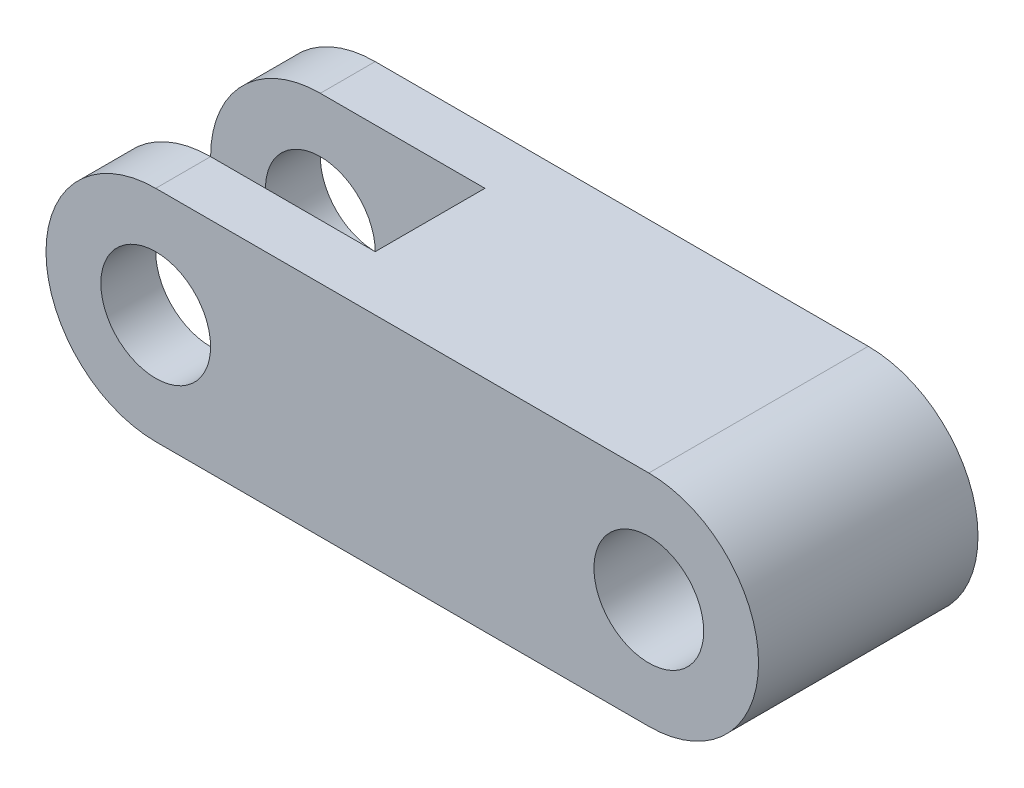
ISO-10303-21;
HEADER;
FILE_DESCRIPTION(('STEP AP214'),'2;1');
FILE_NAME('part.step','',(''),(''),'','','');
FILE_SCHEMA(('AUTOMOTIVE_DESIGN { 1 0 10303 214 1 1 1 1 }'));
ENDSEC;
DATA;
#1=APPLICATION_CONTEXT('core data for automotive mechanical design processes');
#2=APPLICATION_PROTOCOL_DEFINITION('international standard','automotive_design',2000,#1);
#3=PRODUCT_CONTEXT('',#1,'mechanical');
#4=PRODUCT('Part','Part','',(#3));
#5=PRODUCT_RELATED_PRODUCT_CATEGORY('part','',(#4));
#6=PRODUCT_DEFINITION_FORMATION('','',#4);
#7=PRODUCT_DEFINITION_CONTEXT('part definition',#1,'design');
#8=PRODUCT_DEFINITION('design','',#6,#7);
#9=PRODUCT_DEFINITION_SHAPE('','',#8);
#10=(LENGTH_UNIT() NAMED_UNIT(*) SI_UNIT(.MILLI.,.METRE.));
#11=(NAMED_UNIT(*) PLANE_ANGLE_UNIT() SI_UNIT($,.RADIAN.));
#12=(NAMED_UNIT(*) SI_UNIT($,.STERADIAN.) SOLID_ANGLE_UNIT());
#13=UNCERTAINTY_MEASURE_WITH_UNIT(LENGTH_MEASURE(1.E-05),#10,'distance_accuracy_value','');
#14=(GEOMETRIC_REPRESENTATION_CONTEXT(3) GLOBAL_UNCERTAINTY_ASSIGNED_CONTEXT((#13)) GLOBAL_UNIT_ASSIGNED_CONTEXT((#10,
#11,#12)) REPRESENTATION_CONTEXT('',''));
#15=CARTESIAN_POINT('',(0.,0.,0.));
#16=DIRECTION('',(0.,0.,1.));
#17=DIRECTION('',(1.,0.,0.));
#18=AXIS2_PLACEMENT_3D('',#15,#16,#17);
#19=CARTESIAN_POINT('',(0.,0.,-20.));
#20=DIRECTION('',(0.,0.,1.));
#21=DIRECTION('',(-1.,0.,0.));
#22=AXIS2_PLACEMENT_3D('',#19,#20,#21);
#23=CYLINDRICAL_SURFACE('',#22,10.);
#24=DIRECTION('',(0.,0.,1.));
#25=VECTOR('',#24,1.);
#26=CARTESIAN_POINT('',(0.,10.,-20.));
#27=LINE('',#26,#25);
#28=CARTESIAN_POINT('',(0.,10.,-20.));
#29=VERTEX_POINT('',#28);
#30=CARTESIAN_POINT('',(0.,10.,-15.));
#31=VERTEX_POINT('',#30);
#32=EDGE_CURVE('E177',#29,#31,#27,.T.);
#33=ORIENTED_EDGE('',*,*,#32,.F.);
#34=CARTESIAN_POINT('',(0.,0.,-20.));
#35=DIRECTION('',(0.,0.,1.));
#36=DIRECTION('',(1.,0.,0.));
#37=AXIS2_PLACEMENT_3D('',#34,#35,#36);
#38=CIRCLE('',#37,10.);
#39=CARTESIAN_POINT('',(0.,-10.,-20.));
#40=VERTEX_POINT('',#39);
#41=EDGE_CURVE('E159',#29,#40,#38,.T.);
#42=ORIENTED_EDGE('',*,*,#41,.T.);
#43=DIRECTION('',(0.,0.,1.));
#44=VECTOR('',#43,1.);
#45=CARTESIAN_POINT('',(0.,-10.,-20.));
#46=LINE('',#45,#44);
#47=CARTESIAN_POINT('',(0.,-10.,-15.));
#48=VERTEX_POINT('',#47);
#49=EDGE_CURVE('E11',#40,#48,#46,.T.);
#50=ORIENTED_EDGE('',*,*,#49,.T.);
#51=CARTESIAN_POINT('',(0.,0.,-15.));
#52=DIRECTION('',(0.,0.,1.));
#53=DIRECTION('',(1.,0.,0.));
#54=AXIS2_PLACEMENT_3D('',#51,#52,#53);
#55=CIRCLE('',#54,10.);
#56=EDGE_CURVE('E143',#31,#48,#55,.T.);
#57=ORIENTED_EDGE('',*,*,#56,.F.);
#58=EDGE_LOOP('',(#33,#42,#50,#57));
#59=FACE_BOUND('',#58,.T.);
#60=ADVANCED_FACE('F35',(#59),#23,.T.);
#61=CARTESIAN_POINT('',(0.,0.,-20.));
#62=DIRECTION('',(0.,0.,1.));
#63=DIRECTION('',(-1.,0.,0.));
#64=AXIS2_PLACEMENT_3D('',#61,#62,#63);
#65=CYLINDRICAL_SURFACE('',#64,5.);
#66=CARTESIAN_POINT('',(0.,0.,-15.));
#67=DIRECTION('',(0.,0.,1.));
#68=DIRECTION('',(1.,0.,0.));
#69=AXIS2_PLACEMENT_3D('',#66,#67,#68);
#70=CIRCLE('',#69,5.);
#71=CARTESIAN_POINT('',(5.,0.,-15.));
#72=VERTEX_POINT('',#71);
#73=EDGE_CURVE('E39',#72,#72,#70,.T.);
#74=ORIENTED_EDGE('',*,*,#73,.T.);
#75=EDGE_LOOP('',(#74));
#76=FACE_BOUND('',#75,.T.);
#77=CARTESIAN_POINT('',(0.,0.,-20.));
#78=DIRECTION('',(0.,0.,1.));
#79=DIRECTION('',(1.,0.,0.));
#80=AXIS2_PLACEMENT_3D('',#77,#78,#79);
#81=CIRCLE('',#80,5.);
#82=CARTESIAN_POINT('',(5.,0.,-20.));
#83=VERTEX_POINT('',#82);
#84=EDGE_CURVE('E153',#83,#83,#81,.T.);
#85=ORIENTED_EDGE('',*,*,#84,.F.);
#86=EDGE_LOOP('',(#85));
#87=FACE_BOUND('',#86,.T.);
#88=ADVANCED_FACE('F200',(#76,#87),#65,.F.);
#89=CARTESIAN_POINT('',(0.,0.,-20.));
#90=DIRECTION('',(0.,0.,-1.));
#91=DIRECTION('',(1.,0.,0.));
#92=AXIS2_PLACEMENT_3D('',#89,#90,#91);
#93=PLANE('',#92);
#94=ORIENTED_EDGE('',*,*,#84,.T.);
#95=EDGE_LOOP('',(#94));
#96=FACE_BOUND('',#95,.T.);
#97=ORIENTED_EDGE('',*,*,#41,.F.);
#98=DIRECTION('',(-1.,0.,0.));
#99=VECTOR('',#98,1.);
#100=CARTESIAN_POINT('',(0.,10.,-20.));
#101=LINE('',#100,#99);
#102=CARTESIAN_POINT('',(44.9357553758638,10.,-20.));
#103=VERTEX_POINT('',#102);
#104=EDGE_CURVE('E61',#103,#29,#101,.T.);
#105=ORIENTED_EDGE('',*,*,#104,.F.);
#106=CARTESIAN_POINT('',(44.9357553758638,0.,-20.));
#107=DIRECTION('',(0.,0.,1.));
#108=DIRECTION('',(1.,0.,0.));
#109=AXIS2_PLACEMENT_3D('',#106,#107,#108);
#110=CIRCLE('',#109,10.);
#111=CARTESIAN_POINT('',(44.9357553758638,-10.,-20.));
#112=VERTEX_POINT('',#111);
#113=EDGE_CURVE('E164',#112,#103,#110,.T.);
#114=ORIENTED_EDGE('',*,*,#113,.F.);
#115=DIRECTION('',(1.,0.,0.));
#116=VECTOR('',#115,1.);
#117=CARTESIAN_POINT('',(0.,-10.,-20.));
#118=LINE('',#117,#116);
#119=EDGE_CURVE('E89',#40,#112,#118,.T.);
#120=ORIENTED_EDGE('',*,*,#119,.F.);
#121=EDGE_LOOP('',(#97,#105,#114,#120));
#122=FACE_BOUND('',#121,.T.);
#123=CARTESIAN_POINT('',(44.9357553758638,0.,-20.));
#124=DIRECTION('',(0.,0.,1.));
#125=DIRECTION('',(1.,0.,0.));
#126=AXIS2_PLACEMENT_3D('',#123,#124,#125);
#127=CIRCLE('',#126,5.);
#128=CARTESIAN_POINT('',(49.9357553758638,0.,-20.));
#129=VERTEX_POINT('',#128);
#130=EDGE_CURVE('E147',#129,#129,#127,.T.);
#131=ORIENTED_EDGE('',*,*,#130,.T.);
#132=EDGE_LOOP('',(#131));
#133=FACE_BOUND('',#132,.T.);
#134=ADVANCED_FACE('F205',(#96,#122,#133),#93,.T.);
#135=CARTESIAN_POINT('',(0.,0.,0.));
#136=DIRECTION('',(0.,0.,-1.));
#137=DIRECTION('',(1.,0.,0.));
#138=AXIS2_PLACEMENT_3D('',#135,#136,#137);
#139=PLANE('',#138);
#140=CARTESIAN_POINT('',(0.,0.,0.));
#141=DIRECTION('',(0.,0.,1.));
#142=DIRECTION('',(1.,0.,0.));
#143=AXIS2_PLACEMENT_3D('',#140,#141,#142);
#144=CIRCLE('',#143,10.);
#145=CARTESIAN_POINT('',(0.,10.,0.));
#146=VERTEX_POINT('',#145);
#147=CARTESIAN_POINT('',(0.,-10.,0.));
#148=VERTEX_POINT('',#147);
#149=EDGE_CURVE('E156',#146,#148,#144,.T.);
#150=ORIENTED_EDGE('',*,*,#149,.T.);
#151=DIRECTION('',(1.,0.,0.));
#152=VECTOR('',#151,1.);
#153=CARTESIAN_POINT('',(0.,-10.,0.));
#154=LINE('',#153,#152);
#155=CARTESIAN_POINT('',(44.9357553758638,-10.,0.));
#156=VERTEX_POINT('',#155);
#157=EDGE_CURVE('E170',#148,#156,#154,.T.);
#158=ORIENTED_EDGE('',*,*,#157,.T.);
#159=CARTESIAN_POINT('',(44.9357553758638,0.,0.));
#160=DIRECTION('',(0.,0.,1.));
#161=DIRECTION('',(1.,0.,0.));
#162=AXIS2_PLACEMENT_3D('',#159,#160,#161);
#163=CIRCLE('',#162,10.);
#164=CARTESIAN_POINT('',(44.9357553758638,10.,0.));
#165=VERTEX_POINT('',#164);
#166=EDGE_CURVE('E173',#156,#165,#163,.T.);
#167=ORIENTED_EDGE('',*,*,#166,.T.);
#168=DIRECTION('',(-1.,0.,0.));
#169=VECTOR('',#168,1.);
#170=CARTESIAN_POINT('',(0.,10.,0.));
#171=LINE('',#170,#169);
#172=EDGE_CURVE('E162',#165,#146,#171,.T.);
#173=ORIENTED_EDGE('',*,*,#172,.T.);
#174=EDGE_LOOP('',(#150,#158,#167,#173));
#175=FACE_BOUND('',#174,.T.);
#176=CARTESIAN_POINT('',(0.,0.,0.));
#177=DIRECTION('',(0.,0.,1.));
#178=DIRECTION('',(1.,0.,0.));
#179=AXIS2_PLACEMENT_3D('',#176,#177,#178);
#180=CIRCLE('',#179,5.);
#181=CARTESIAN_POINT('',(5.,0.,0.));
#182=VERTEX_POINT('',#181);
#183=EDGE_CURVE('E150',#182,#182,#180,.T.);
#184=ORIENTED_EDGE('',*,*,#183,.F.);
#185=EDGE_LOOP('',(#184));
#186=FACE_BOUND('',#185,.T.);
#187=CARTESIAN_POINT('',(44.9357553758638,0.,0.));
#188=DIRECTION('',(0.,0.,1.));
#189=DIRECTION('',(1.,0.,0.));
#190=AXIS2_PLACEMENT_3D('',#187,#188,#189);
#191=CIRCLE('',#190,5.);
#192=CARTESIAN_POINT('',(49.9357553758638,0.,0.));
#193=VERTEX_POINT('',#192);
#194=EDGE_CURVE('E146',#193,#193,#191,.T.);
#195=ORIENTED_EDGE('',*,*,#194,.F.);
#196=EDGE_LOOP('',(#195));
#197=FACE_BOUND('',#196,.T.);
#198=ADVANCED_FACE('F210',(#175,#186,#197),#139,.F.);
#199=CARTESIAN_POINT('',(0.,0.,-5.));
#200=DIRECTION('',(0.,0.,-1.));
#201=DIRECTION('',(-1.,0.,0.));
#202=AXIS2_PLACEMENT_3D('',#199,#200,#201);
#203=CIRCLE('',#202,10.);
#204=CARTESIAN_POINT('',(0.,-10.,-5.));
#205=VERTEX_POINT('',#204);
#206=CARTESIAN_POINT('',(0.,10.,-5.));
#207=VERTEX_POINT('',#206);
#208=EDGE_CURVE('E141',#205,#207,#203,.T.);
#209=ORIENTED_EDGE('',*,*,#208,.F.);
#210=EDGE_CURVE('E44',#205,#148,#46,.T.);
#211=ORIENTED_EDGE('',*,*,#210,.T.);
#212=ORIENTED_EDGE('',*,*,#149,.F.);
#213=EDGE_CURVE('E82',#207,#146,#27,.T.);
#214=ORIENTED_EDGE('',*,*,#213,.F.);
#215=EDGE_LOOP('',(#209,#211,#212,#214));
#216=FACE_BOUND('',#215,.T.);
#217=ADVANCED_FACE('F37',(#216),#23,.T.);
#218=CARTESIAN_POINT('',(0.,-10.,-20.));
#219=DIRECTION('',(0.,1.,0.));
#220=DIRECTION('',(0.,0.,-1.));
#221=AXIS2_PLACEMENT_3D('',#218,#219,#220);
#222=PLANE('',#221);
#223=ORIENTED_EDGE('',*,*,#49,.F.);
#224=ORIENTED_EDGE('',*,*,#119,.T.);
#225=DIRECTION('',(0.,0.,1.));
#226=VECTOR('',#225,1.);
#227=CARTESIAN_POINT('',(44.9357553758638,-10.,-20.));
#228=LINE('',#227,#226);
#229=EDGE_CURVE('E181',#112,#156,#228,.T.);
#230=ORIENTED_EDGE('',*,*,#229,.T.);
#231=ORIENTED_EDGE('',*,*,#157,.F.);
#232=ORIENTED_EDGE('',*,*,#210,.F.);
#233=DIRECTION('',(-1.,0.,0.));
#234=VECTOR('',#233,1.);
#235=CARTESIAN_POINT('',(15.,-10.,-5.));
#236=LINE('',#235,#234);
#237=CARTESIAN_POINT('',(15.,-10.,-5.));
#238=VERTEX_POINT('',#237);
#239=EDGE_CURVE('E114',#238,#205,#236,.T.);
#240=ORIENTED_EDGE('',*,*,#239,.F.);
#241=DIRECTION('',(0.,0.,1.));
#242=VECTOR('',#241,1.);
#243=CARTESIAN_POINT('',(15.,-10.,-5.));
#244=LINE('',#243,#242);
#245=CARTESIAN_POINT('',(15.,-10.,-15.));
#246=VERTEX_POINT('',#245);
#247=EDGE_CURVE('E122',#246,#238,#244,.T.);
#248=ORIENTED_EDGE('',*,*,#247,.F.);
#249=DIRECTION('',(1.,0.,0.));
#250=VECTOR('',#249,1.);
#251=CARTESIAN_POINT('',(15.,-10.,-15.));
#252=LINE('',#251,#250);
#253=EDGE_CURVE('E119',#48,#246,#252,.T.);
#254=ORIENTED_EDGE('',*,*,#253,.F.);
#255=EDGE_LOOP('',(#223,#224,#230,#231,#232,#240,#248,#254));
#256=FACE_BOUND('',#255,.T.);
#257=ADVANCED_FACE('F128',(#256),#222,.F.);
#258=CARTESIAN_POINT('',(44.9357553758638,0.,-20.));
#259=DIRECTION('',(0.,0.,1.));
#260=DIRECTION('',(-1.,0.,0.));
#261=AXIS2_PLACEMENT_3D('',#258,#259,#260);
#262=CYLINDRICAL_SURFACE('',#261,10.);
#263=ORIENTED_EDGE('',*,*,#166,.F.);
#264=ORIENTED_EDGE('',*,*,#229,.F.);
#265=ORIENTED_EDGE('',*,*,#113,.T.);
#266=DIRECTION('',(0.,0.,1.));
#267=VECTOR('',#266,1.);
#268=CARTESIAN_POINT('',(44.9357553758638,10.,-20.));
#269=LINE('',#268,#267);
#270=EDGE_CURVE('E179',#103,#165,#269,.T.);
#271=ORIENTED_EDGE('',*,*,#270,.T.);
#272=EDGE_LOOP('',(#263,#264,#265,#271));
#273=FACE_BOUND('',#272,.T.);
#274=ADVANCED_FACE('F216',(#273),#262,.T.);
#275=CARTESIAN_POINT('',(0.,10.,-20.));
#276=DIRECTION('',(0.,-1.,0.));
#277=DIRECTION('',(0.,0.,1.));
#278=AXIS2_PLACEMENT_3D('',#275,#276,#277);
#279=PLANE('',#278);
#280=DIRECTION('',(0.,0.,1.));
#281=VECTOR('',#280,1.);
#282=CARTESIAN_POINT('',(15.,10.,-5.));
#283=LINE('',#282,#281);
#284=CARTESIAN_POINT('',(15.,10.,-15.));
#285=VERTEX_POINT('',#284);
#286=CARTESIAN_POINT('',(15.,10.,-5.));
#287=VERTEX_POINT('',#286);
#288=EDGE_CURVE('E134',#285,#287,#283,.T.);
#289=ORIENTED_EDGE('',*,*,#288,.T.);
#290=DIRECTION('',(-1.,0.,0.));
#291=VECTOR('',#290,1.);
#292=CARTESIAN_POINT('',(15.,10.,-5.));
#293=LINE('',#292,#291);
#294=EDGE_CURVE('E116',#287,#207,#293,.T.);
#295=ORIENTED_EDGE('',*,*,#294,.T.);
#296=ORIENTED_EDGE('',*,*,#213,.T.);
#297=ORIENTED_EDGE('',*,*,#172,.F.);
#298=ORIENTED_EDGE('',*,*,#270,.F.);
#299=ORIENTED_EDGE('',*,*,#104,.T.);
#300=ORIENTED_EDGE('',*,*,#32,.T.);
#301=DIRECTION('',(1.,0.,0.));
#302=VECTOR('',#301,1.);
#303=CARTESIAN_POINT('',(15.,10.,-15.));
#304=LINE('',#303,#302);
#305=EDGE_CURVE('E126',#31,#285,#304,.T.);
#306=ORIENTED_EDGE('',*,*,#305,.T.);
#307=EDGE_LOOP('',(#289,#295,#296,#297,#298,#299,#300,#306));
#308=FACE_BOUND('',#307,.T.);
#309=ADVANCED_FACE('F222',(#308),#279,.F.);
#310=CARTESIAN_POINT('',(0.,0.,-5.));
#311=DIRECTION('',(0.,0.,-1.));
#312=DIRECTION('',(-1.,0.,0.));
#313=AXIS2_PLACEMENT_3D('',#310,#311,#312);
#314=CIRCLE('',#313,5.);
#315=CARTESIAN_POINT('',(-5.,0.,-5.));
#316=VERTEX_POINT('',#315);
#317=EDGE_CURVE('E139',#316,#316,#314,.T.);
#318=ORIENTED_EDGE('',*,*,#317,.T.);
#319=EDGE_LOOP('',(#318));
#320=FACE_BOUND('',#319,.T.);
#321=ORIENTED_EDGE('',*,*,#183,.T.);
#322=EDGE_LOOP('',(#321));
#323=FACE_BOUND('',#322,.T.);
#324=ADVANCED_FACE('F185',(#320,#323),#65,.F.);
#325=CARTESIAN_POINT('',(44.9357553758638,0.,-20.));
#326=DIRECTION('',(0.,0.,1.));
#327=DIRECTION('',(-1.,0.,0.));
#328=AXIS2_PLACEMENT_3D('',#325,#326,#327);
#329=CYLINDRICAL_SURFACE('',#328,5.);
#330=ORIENTED_EDGE('',*,*,#130,.F.);
#331=EDGE_LOOP('',(#330));
#332=FACE_BOUND('',#331,.T.);
#333=ORIENTED_EDGE('',*,*,#194,.T.);
#334=EDGE_LOOP('',(#333));
#335=FACE_BOUND('',#334,.T.);
#336=ADVANCED_FACE('F196',(#332,#335),#329,.F.);
#337=CARTESIAN_POINT('',(15.,-10.,-15.));
#338=DIRECTION('',(0.,0.,-1.));
#339=DIRECTION('',(1.,0.,0.));
#340=AXIS2_PLACEMENT_3D('',#337,#338,#339);
#341=PLANE('',#340);
#342=ORIENTED_EDGE('',*,*,#73,.F.);
#343=EDGE_LOOP('',(#342));
#344=FACE_BOUND('',#343,.T.);
#345=ORIENTED_EDGE('',*,*,#305,.F.);
#346=ORIENTED_EDGE('',*,*,#56,.T.);
#347=ORIENTED_EDGE('',*,*,#253,.T.);
#348=DIRECTION('',(0.,1.,0.));
#349=VECTOR('',#348,1.);
#350=CARTESIAN_POINT('',(15.,-10.,-15.));
#351=LINE('',#350,#349);
#352=EDGE_CURVE('E118',#246,#285,#351,.T.);
#353=ORIENTED_EDGE('',*,*,#352,.T.);
#354=EDGE_LOOP('',(#345,#346,#347,#353));
#355=FACE_BOUND('',#354,.T.);
#356=ADVANCED_FACE('F189',(#344,#355),#341,.F.);
#357=CARTESIAN_POINT('',(15.,-10.,-5.));
#358=DIRECTION('',(0.,0.,1.));
#359=DIRECTION('',(-1.,0.,0.));
#360=AXIS2_PLACEMENT_3D('',#357,#358,#359);
#361=PLANE('',#360);
#362=ORIENTED_EDGE('',*,*,#317,.F.);
#363=EDGE_LOOP('',(#362));
#364=FACE_BOUND('',#363,.T.);
#365=ORIENTED_EDGE('',*,*,#208,.T.);
#366=ORIENTED_EDGE('',*,*,#294,.F.);
#367=DIRECTION('',(0.,1.,0.));
#368=VECTOR('',#367,1.);
#369=CARTESIAN_POINT('',(15.,-10.,-5.));
#370=LINE('',#369,#368);
#371=EDGE_CURVE('E52',#238,#287,#370,.T.);
#372=ORIENTED_EDGE('',*,*,#371,.F.);
#373=ORIENTED_EDGE('',*,*,#239,.T.);
#374=EDGE_LOOP('',(#365,#366,#372,#373));
#375=FACE_BOUND('',#374,.T.);
#376=ADVANCED_FACE('F112',(#364,#375),#361,.F.);
#377=CARTESIAN_POINT('',(15.,-10.,-5.));
#378=DIRECTION('',(1.,0.,0.));
#379=DIRECTION('',(0.,0.,1.));
#380=AXIS2_PLACEMENT_3D('',#377,#378,#379);
#381=PLANE('',#380);
#382=ORIENTED_EDGE('',*,*,#288,.F.);
#383=ORIENTED_EDGE('',*,*,#352,.F.);
#384=ORIENTED_EDGE('',*,*,#247,.T.);
#385=ORIENTED_EDGE('',*,*,#371,.T.);
#386=EDGE_LOOP('',(#382,#383,#384,#385));
#387=FACE_BOUND('',#386,.T.);
#388=ADVANCED_FACE('F123',(#387),#381,.F.);
#389=CLOSED_SHELL('',(#60,#88,#134,#198,#217,#257,#274,#309,#324,#336,#356,#376,#388));
#390=MANIFOLD_SOLID_BREP('B2',#389);
#391=ADVANCED_BREP_SHAPE_REPRESENTATION('',(#18,#390),#14);
#392=SHAPE_DEFINITION_REPRESENTATION(#9,#391);
ENDSEC;
END-ISO-10303-21;
